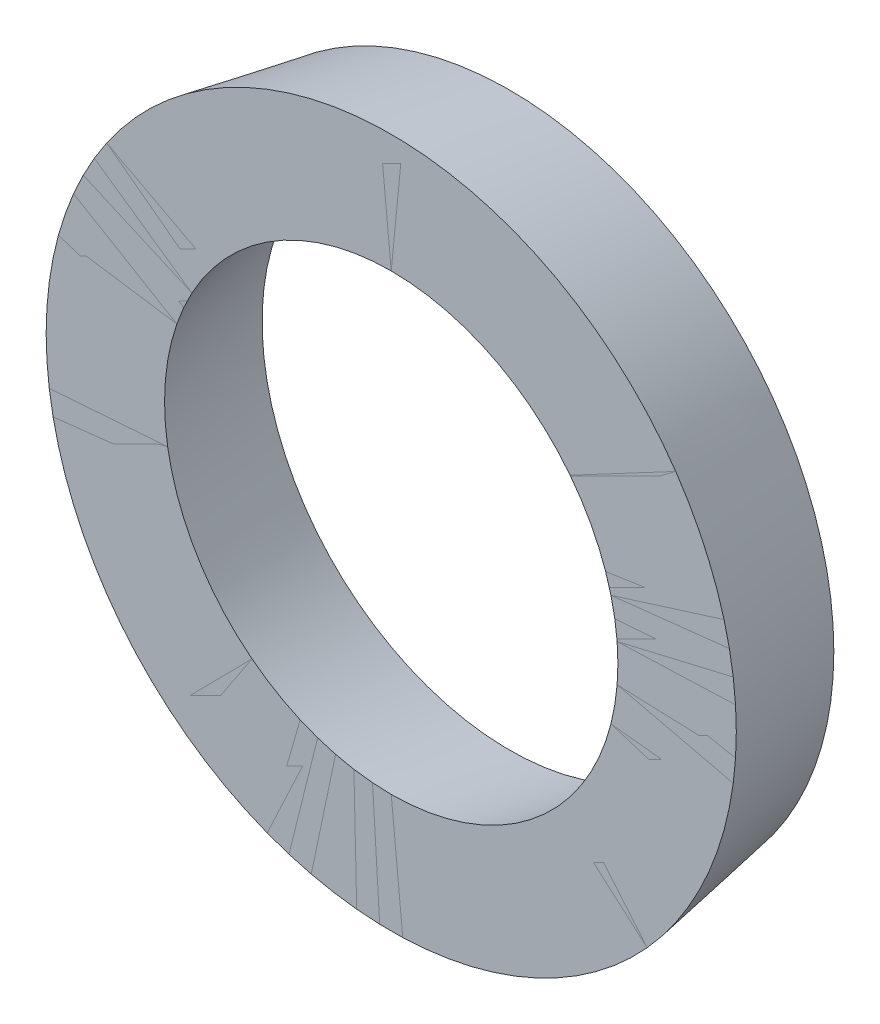
ISO-10303-21;
HEADER;
FILE_DESCRIPTION(('STEP AP214'),'2;1');
FILE_NAME('part.step','',(''),(''),'','','');
FILE_SCHEMA(('AUTOMOTIVE_DESIGN { 1 0 10303 214 1 1 1 1 }'));
ENDSEC;
DATA;
#1=APPLICATION_CONTEXT('core data for automotive mechanical design processes');
#2=APPLICATION_PROTOCOL_DEFINITION('international standard','automotive_design',2000,#1);
#3=PRODUCT_CONTEXT('',#1,'mechanical');
#4=PRODUCT('Part','Part','',(#3));
#5=PRODUCT_RELATED_PRODUCT_CATEGORY('part','',(#4));
#6=PRODUCT_DEFINITION_FORMATION('','',#4);
#7=PRODUCT_DEFINITION_CONTEXT('part definition',#1,'design');
#8=PRODUCT_DEFINITION('design','',#6,#7);
#9=PRODUCT_DEFINITION_SHAPE('','',#8);
#10=(LENGTH_UNIT() NAMED_UNIT(*) SI_UNIT(.MILLI.,.METRE.));
#11=(NAMED_UNIT(*) PLANE_ANGLE_UNIT() SI_UNIT($,.RADIAN.));
#12=(NAMED_UNIT(*) SI_UNIT($,.STERADIAN.) SOLID_ANGLE_UNIT());
#13=UNCERTAINTY_MEASURE_WITH_UNIT(LENGTH_MEASURE(1.E-05),#10,'distance_accuracy_value','');
#14=(GEOMETRIC_REPRESENTATION_CONTEXT(3) GLOBAL_UNCERTAINTY_ASSIGNED_CONTEXT((#13)) GLOBAL_UNIT_ASSIGNED_CONTEXT((#10,
#11,#12)) REPRESENTATION_CONTEXT('',''));
#15=CARTESIAN_POINT('',(0.,0.,0.));
#16=DIRECTION('',(0.,0.,1.));
#17=DIRECTION('',(1.,0.,0.));
#18=AXIS2_PLACEMENT_3D('',#15,#16,#17);
#19=CARTESIAN_POINT('',(0.,0.,0.));
#20=DIRECTION('',(0.,0.,1.));
#21=DIRECTION('',(1.,0.,0.));
#22=AXIS2_PLACEMENT_3D('',#19,#20,#21);
#23=CONICAL_SURFACE('',#22,29.1429075648442,0.174532925199433);
#24=CARTESIAN_POINT('',(0.,0.,-10.));
#25=DIRECTION('',(0.,0.,1.));
#26=DIRECTION('',(1.,0.,0.));
#27=AXIS2_PLACEMENT_3D('',#24,#25,#26);
#28=CIRCLE('',#27,27.3796377577596);
#29=CARTESIAN_POINT('',(27.3796377577596,0.,-10.));
#30=VERTEX_POINT('',#29);
#31=EDGE_CURVE('E13',#30,#30,#28,.T.);
#32=ORIENTED_EDGE('',*,*,#31,.T.);
#33=EDGE_LOOP('',(#32));
#34=FACE_BOUND('',#33,.T.);
#35=CARTESIAN_POINT('',(0.,0.,0.));
#36=DIRECTION('',(0.,0.,1.));
#37=DIRECTION('',(1.,0.,0.));
#38=AXIS2_PLACEMENT_3D('',#35,#36,#37);
#39=CIRCLE('',#38,29.1429075648442);
#40=CARTESIAN_POINT('',(29.1429075648442,0.,0.));
#41=VERTEX_POINT('',#40);
#42=EDGE_CURVE('E58',#41,#41,#39,.T.);
#43=ORIENTED_EDGE('',*,*,#42,.F.);
#44=EDGE_LOOP('',(#43));
#45=FACE_BOUND('',#44,.T.);
#46=ADVANCED_FACE('F52',(#34,#45),#23,.T.);
#47=CARTESIAN_POINT('',(0.,0.,-10.));
#48=DIRECTION('',(0.,0.,1.));
#49=DIRECTION('',(1.,0.,0.));
#50=AXIS2_PLACEMENT_3D('',#47,#48,#49);
#51=PLANE('',#50);
#52=CARTESIAN_POINT('',(0.,0.,-10.));
#53=DIRECTION('',(0.,0.,1.));
#54=DIRECTION('',(1.,0.,0.));
#55=AXIS2_PLACEMENT_3D('',#52,#53,#54);
#56=CIRCLE('',#55,20.9061773719289);
#57=CARTESIAN_POINT('',(20.9061773719289,0.,-10.));
#58=VERTEX_POINT('',#57);
#59=EDGE_CURVE('E62',#58,#58,#56,.T.);
#60=ORIENTED_EDGE('',*,*,#59,.T.);
#61=EDGE_LOOP('',(#60));
#62=FACE_BOUND('',#61,.T.);
#63=ORIENTED_EDGE('',*,*,#31,.F.);
#64=EDGE_LOOP('',(#63));
#65=FACE_BOUND('',#64,.T.);
#66=ADVANCED_FACE('F76',(#62,#65),#51,.F.);
#67=CARTESIAN_POINT('',(0.,0.,0.));
#68=DIRECTION('',(0.,0.,1.));
#69=DIRECTION('',(1.,0.,0.));
#70=AXIS2_PLACEMENT_3D('',#67,#68,#69);
#71=PLANE('',#70);
#72=CARTESIAN_POINT('',(0.,0.,0.));
#73=DIRECTION('',(0.,0.,1.));
#74=DIRECTION('',(1.,0.,0.));
#75=AXIS2_PLACEMENT_3D('',#72,#73,#74);
#76=CIRCLE('',#75,19.1429075648442);
#77=CARTESIAN_POINT('',(19.1429075648442,0.,0.));
#78=VERTEX_POINT('',#77);
#79=EDGE_CURVE('E67',#78,#78,#76,.T.);
#80=ORIENTED_EDGE('',*,*,#79,.F.);
#81=EDGE_LOOP('',(#80));
#82=FACE_BOUND('',#81,.T.);
#83=ORIENTED_EDGE('',*,*,#42,.T.);
#84=EDGE_LOOP('',(#83));
#85=FACE_BOUND('',#84,.T.);
#86=ADVANCED_FACE('F74',(#82,#85),#71,.T.);
#87=CARTESIAN_POINT('',(0.,0.,0.));
#88=DIRECTION('',(0.,0.,-1.));
#89=DIRECTION('',(1.,0.,0.));
#90=AXIS2_PLACEMENT_3D('',#87,#88,#89);
#91=CONICAL_SURFACE('',#90,19.1429075648442,0.174532925199433);
#92=ORIENTED_EDGE('',*,*,#59,.F.);
#93=EDGE_LOOP('',(#92));
#94=FACE_BOUND('',#93,.T.);
#95=ORIENTED_EDGE('',*,*,#79,.T.);
#96=EDGE_LOOP('',(#95));
#97=FACE_BOUND('',#96,.T.);
#98=ADVANCED_FACE('F72',(#94,#97),#91,.F.);
#99=CLOSED_SHELL('',(#46,#66,#86,#98));
#100=MANIFOLD_SOLID_BREP('B2',#99);
#101=CARTESIAN_POINT('',(0.,0.,0.));
#102=DIRECTION('',(0.,0.,1.));
#103=DIRECTION('',(1.,0.,0.));
#104=AXIS2_PLACEMENT_3D('',#101,#102,#103);
#105=PLANE('',#104);
#106=CARTESIAN_POINT('',(0.,0.,0.));
#107=DIRECTION('',(0.,0.,1.));
#108=DIRECTION('',(1.,0.,0.));
#109=AXIS2_PLACEMENT_3D('',#106,#107,#108);
#110=CIRCLE('',#109,19.1429075648442);
#111=CARTESIAN_POINT('',(19.1429075648442,0.,0.));
#112=VERTEX_POINT('',#111);
#113=EDGE_CURVE('E118',#112,#112,#110,.T.);
#114=ORIENTED_EDGE('',*,*,#113,.F.);
#115=EDGE_LOOP('',(#114));
#116=FACE_BOUND('',#115,.T.);
#117=CARTESIAN_POINT('',(0.,0.,0.));
#118=DIRECTION('',(0.,0.,1.));
#119=DIRECTION('',(1.,0.,0.));
#120=AXIS2_PLACEMENT_3D('',#117,#118,#119);
#121=CIRCLE('',#120,29.1429075648442);
#122=CARTESIAN_POINT('',(29.1429075648442,0.,0.));
#123=VERTEX_POINT('',#122);
#124=EDGE_CURVE('E51',#123,#123,#121,.T.);
#125=ORIENTED_EDGE('',*,*,#124,.T.);
#126=EDGE_LOOP('',(#125));
#127=FACE_BOUND('',#126,.T.);
#128=ADVANCED_FACE('F114',(#116,#127),#105,.T.);
#129=OPEN_SHELL('',(#128));
#130=SHELL_BASED_SURFACE_MODEL('B8',(#129));
#131=ADVANCED_BREP_SHAPE_REPRESENTATION('',(#18,#100),#14);
#132=MANIFOLD_SURFACE_SHAPE_REPRESENTATION('',(#18,#130),#14);
#133=SHAPE_REPRESENTATION('',(#18),#14);
#134=SHAPE_DEFINITION_REPRESENTATION(#9,#133);
#135=SHAPE_REPRESENTATION_RELATIONSHIP('','',#133,#131);
#136=SHAPE_REPRESENTATION_RELATIONSHIP('','',#133,#132);
ENDSEC;
END-ISO-10303-21;
